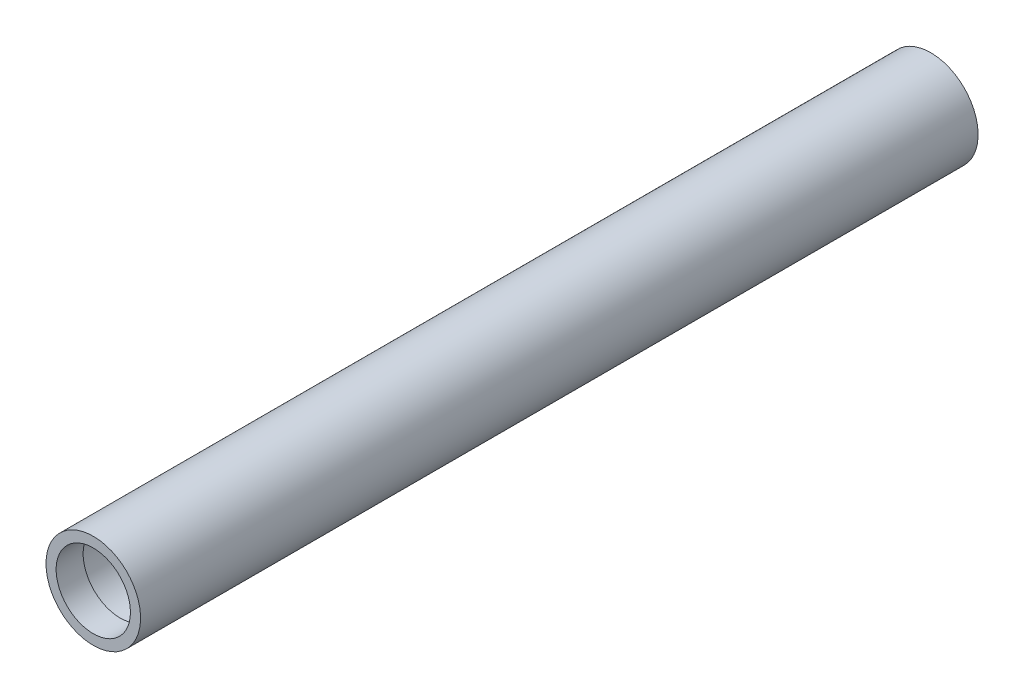
ISO-10303-21;
HEADER;
FILE_DESCRIPTION(('STEP AP214'),'2;1');
FILE_NAME('part.step','',(''),(''),'','','');
FILE_SCHEMA(('AUTOMOTIVE_DESIGN { 1 0 10303 214 1 1 1 1 }'));
ENDSEC;
DATA;
#1=APPLICATION_CONTEXT('core data for automotive mechanical design processes');
#2=APPLICATION_PROTOCOL_DEFINITION('international standard','automotive_design',2000,#1);
#3=PRODUCT_CONTEXT('',#1,'mechanical');
#4=PRODUCT('Part','Part','',(#3));
#5=PRODUCT_RELATED_PRODUCT_CATEGORY('part','',(#4));
#6=PRODUCT_DEFINITION_FORMATION('','',#4);
#7=PRODUCT_DEFINITION_CONTEXT('part definition',#1,'design');
#8=PRODUCT_DEFINITION('design','',#6,#7);
#9=PRODUCT_DEFINITION_SHAPE('','',#8);
#10=(LENGTH_UNIT() NAMED_UNIT(*) SI_UNIT(.MILLI.,.METRE.));
#11=(NAMED_UNIT(*) PLANE_ANGLE_UNIT() SI_UNIT($,.RADIAN.));
#12=(NAMED_UNIT(*) SI_UNIT($,.STERADIAN.) SOLID_ANGLE_UNIT());
#13=UNCERTAINTY_MEASURE_WITH_UNIT(LENGTH_MEASURE(1.E-05),#10,'distance_accuracy_value','');
#14=(GEOMETRIC_REPRESENTATION_CONTEXT(3) GLOBAL_UNCERTAINTY_ASSIGNED_CONTEXT((#13)) GLOBAL_UNIT_ASSIGNED_CONTEXT((#10,
#11,#12)) REPRESENTATION_CONTEXT('',''));
#15=CARTESIAN_POINT('',(0.,0.,0.));
#16=DIRECTION('',(0.,0.,1.));
#17=DIRECTION('',(1.,0.,0.));
#18=AXIS2_PLACEMENT_3D('',#15,#16,#17);
#19=CARTESIAN_POINT('',(0.,0.,0.));
#20=DIRECTION('',(0.,0.,1.));
#21=DIRECTION('',(1.,0.,0.));
#22=AXIS2_PLACEMENT_3D('',#19,#20,#21);
#23=PLANE('',#22);
#24=CARTESIAN_POINT('',(0.,0.,0.));
#25=DIRECTION('',(0.,0.,1.));
#26=DIRECTION('',(1.,0.,0.));
#27=AXIS2_PLACEMENT_3D('',#24,#25,#26);
#28=CIRCLE('',#27,4.445);
#29=CARTESIAN_POINT('',(-4.445,0.,0.));
#30=VERTEX_POINT('',#29);
#31=EDGE_CURVE('E10',#30,#30,#28,.T.);
#32=ORIENTED_EDGE('',*,*,#31,.F.);
#33=EDGE_LOOP('',(#32));
#34=FACE_BOUND('',#33,.T.);
#35=CARTESIAN_POINT('',(0.,0.,0.));
#36=DIRECTION('',(0.,0.,1.));
#37=DIRECTION('',(1.,0.,0.));
#38=AXIS2_PLACEMENT_3D('',#35,#36,#37);
#39=CIRCLE('',#38,3.81);
#40=CARTESIAN_POINT('',(-3.81,0.,0.));
#41=VERTEX_POINT('',#40);
#42=EDGE_CURVE('E38',#41,#41,#39,.T.);
#43=ORIENTED_EDGE('',*,*,#42,.T.);
#44=EDGE_LOOP('',(#43));
#45=FACE_BOUND('',#44,.T.);
#46=ADVANCED_FACE('F31',(#34,#45),#23,.F.);
#47=CARTESIAN_POINT('',(0.,0.,76.2));
#48=DIRECTION('',(0.,0.,-1.));
#49=DIRECTION('',(-1.,0.,0.));
#50=AXIS2_PLACEMENT_3D('',#47,#48,#49);
#51=CYLINDRICAL_SURFACE('',#50,4.445);
#52=CARTESIAN_POINT('',(0.,0.,78.74));
#53=DIRECTION('',(0.,0.,1.));
#54=DIRECTION('',(1.,0.,0.));
#55=AXIS2_PLACEMENT_3D('',#52,#53,#54);
#56=CIRCLE('',#55,4.445);
#57=CARTESIAN_POINT('',(-4.445,0.,78.74));
#58=VERTEX_POINT('',#57);
#59=EDGE_CURVE('E46',#58,#58,#56,.T.);
#60=CARTESIAN_POINT('',(-4.445,0.,0.));
#61=CARTESIAN_POINT('',(-4.445,0.,0.82020833333333));
#62=CARTESIAN_POINT('',(-4.445,0.,1.64041666666666));
#63=CARTESIAN_POINT('',(-4.445,0.,3.28083333333333));
#64=CARTESIAN_POINT('',(-4.445,0.,4.10104166666667));
#65=CARTESIAN_POINT('',(-4.445,0.,5.74145833333333));
#66=CARTESIAN_POINT('',(-4.445,0.,6.56166666666666));
#67=CARTESIAN_POINT('',(-4.445,0.,8.20208333333333));
#68=CARTESIAN_POINT('',(-4.445,0.,9.02229166666667));
#69=CARTESIAN_POINT('',(-4.445,0.,10.6627083333333));
#70=CARTESIAN_POINT('',(-4.445,0.,11.4829166666667));
#71=CARTESIAN_POINT('',(-4.445,0.,13.1233333333333));
#72=CARTESIAN_POINT('',(-4.445,0.,13.9435416666667));
#73=CARTESIAN_POINT('',(-4.445,0.,15.5839583333333));
#74=CARTESIAN_POINT('',(-4.445,0.,16.4041666666667));
#75=CARTESIAN_POINT('',(-4.445,0.,18.0445833333333));
#76=CARTESIAN_POINT('',(-4.445,0.,18.8647916666667));
#77=CARTESIAN_POINT('',(-4.445,0.,20.5052083333333));
#78=CARTESIAN_POINT('',(-4.445,0.,21.3254166666667));
#79=CARTESIAN_POINT('',(-4.445,0.,22.9658333333333));
#80=CARTESIAN_POINT('',(-4.445,0.,23.7860416666667));
#81=CARTESIAN_POINT('',(-4.445,0.,25.4264583333333));
#82=CARTESIAN_POINT('',(-4.445,0.,26.2466666666667));
#83=CARTESIAN_POINT('',(-4.445,0.,27.8870833333333));
#84=CARTESIAN_POINT('',(-4.445,0.,28.7072916666667));
#85=CARTESIAN_POINT('',(-4.445,0.,30.3477083333333));
#86=CARTESIAN_POINT('',(-4.445,0.,31.1679166666667));
#87=CARTESIAN_POINT('',(-4.445,0.,32.8083333333333));
#88=CARTESIAN_POINT('',(-4.445,0.,33.6285416666667));
#89=CARTESIAN_POINT('',(-4.445,0.,35.2689583333333));
#90=CARTESIAN_POINT('',(-4.445,0.,36.0891666666667));
#91=CARTESIAN_POINT('',(-4.445,0.,37.7295833333333));
#92=CARTESIAN_POINT('',(-4.445,0.,38.5497916666667));
#93=CARTESIAN_POINT('',(-4.445,0.,40.1902083333333));
#94=CARTESIAN_POINT('',(-4.445,0.,41.0104166666667));
#95=CARTESIAN_POINT('',(-4.445,0.,42.6508333333333));
#96=CARTESIAN_POINT('',(-4.445,0.,43.4710416666667));
#97=CARTESIAN_POINT('',(-4.445,0.,45.1114583333333));
#98=CARTESIAN_POINT('',(-4.445,0.,45.9316666666667));
#99=CARTESIAN_POINT('',(-4.445,0.,47.5720833333333));
#100=CARTESIAN_POINT('',(-4.445,0.,48.3922916666667));
#101=CARTESIAN_POINT('',(-4.445,0.,50.0327083333333));
#102=CARTESIAN_POINT('',(-4.445,0.,50.8529166666667));
#103=CARTESIAN_POINT('',(-4.445,0.,52.4933333333333));
#104=CARTESIAN_POINT('',(-4.445,0.,53.3135416666667));
#105=CARTESIAN_POINT('',(-4.445,0.,54.9539583333333));
#106=CARTESIAN_POINT('',(-4.445,0.,55.7741666666667));
#107=CARTESIAN_POINT('',(-4.445,0.,57.4145833333333));
#108=CARTESIAN_POINT('',(-4.445,0.,58.2347916666667));
#109=CARTESIAN_POINT('',(-4.445,0.,59.8752083333333));
#110=CARTESIAN_POINT('',(-4.445,0.,60.6954166666667));
#111=CARTESIAN_POINT('',(-4.445,0.,62.3358333333333));
#112=CARTESIAN_POINT('',(-4.445,0.,63.1560416666666));
#113=CARTESIAN_POINT('',(-4.445,0.,64.7964583333333));
#114=CARTESIAN_POINT('',(-4.445,0.,65.6166666666667));
#115=CARTESIAN_POINT('',(-4.445,0.,67.2570833333333));
#116=CARTESIAN_POINT('',(-4.445,0.,68.0772916666667));
#117=CARTESIAN_POINT('',(-4.445,0.,69.7177083333333));
#118=CARTESIAN_POINT('',(-4.445,0.,70.5379166666667));
#119=CARTESIAN_POINT('',(-4.445,0.,72.1783333333333));
#120=CARTESIAN_POINT('',(-4.445,0.,72.9985416666667));
#121=CARTESIAN_POINT('',(-4.445,0.,74.6389583333333));
#122=CARTESIAN_POINT('',(-4.445,0.,75.4591666666667));
#123=CARTESIAN_POINT('',(-4.445,0.,77.0995833333333));
#124=CARTESIAN_POINT('',(-4.445,0.,77.9197916666667));
#125=CARTESIAN_POINT('',(-4.445,0.,78.74));
#126=B_SPLINE_CURVE_WITH_KNOTS('',3,(#60,#61,#62,#63,#64,#65,#66,#67,#68,#69,#70,#71,#72,#73,
#74,#75,#76,#77,#78,#79,#80,#81,#82,#83,#84,#85,#86,#87,#88,#89,#90,#91,#92,#93,#94,#95,#96,#97,
#98,#99,#100,#101,#102,#103,#104,#105,#106,#107,#108,#109,#110,#111,#112,#113,#114,#115,#116,
#117,#118,#119,#120,#121,#122,#123,#124,#125),.UNSPECIFIED.,.F.,.F.,(4,2,2,2,2,2,2,2,2,2,2,2,2,
2,2,2,2,2,2,2,2,2,2,2,2,2,2,2,2,2,2,2,4),(0.,2.46062499999999,4.92125,7.381875,9.8425,12.303125,
14.76375,17.224375,19.685,22.145625,24.60625,27.066875,29.5275,31.988125,34.44875,36.909375,
39.37,41.830625,44.29125,46.751875,49.2125,51.673125,54.13375,56.594375,59.055,61.515625,
63.97625,66.436875,68.8975,71.358125,73.81875,76.279375,78.74),.UNSPECIFIED.);
#127=EDGE_CURVE('BSEAM33',#30,#58,#126,.T.);
#128=ORIENTED_EDGE('',*,*,#31,.T.);
#129=ORIENTED_EDGE('',*,*,#59,.F.);
#130=ORIENTED_EDGE('',*,*,#127,.T.);
#131=ORIENTED_EDGE('',*,*,#127,.F.);
#132=EDGE_LOOP('',(#128,#130,#129,#131));
#133=FACE_BOUND('',#132,.T.);
#134=ADVANCED_FACE('F33',(#133),#51,.T.);
#135=CARTESIAN_POINT('',(0.,0.,76.2));
#136=DIRECTION('',(0.,0.,-1.));
#137=DIRECTION('',(-1.,0.,0.));
#138=AXIS2_PLACEMENT_3D('',#135,#136,#137);
#139=CYLINDRICAL_SURFACE('',#138,3.81);
#140=CARTESIAN_POINT('',(0.,0.,76.2));
#141=DIRECTION('',(0.,0.,1.));
#142=DIRECTION('',(1.,0.,0.));
#143=AXIS2_PLACEMENT_3D('',#140,#141,#142);
#144=CIRCLE('',#143,3.81);
#145=CARTESIAN_POINT('',(-3.81,0.,76.2));
#146=VERTEX_POINT('',#145);
#147=EDGE_CURVE('E42',#146,#146,#144,.T.);
#148=CARTESIAN_POINT('',(-3.81,0.,76.2));
#149=CARTESIAN_POINT('',(-3.81,0.,75.40625));
#150=CARTESIAN_POINT('',(-3.81,0.,74.6125));
#151=CARTESIAN_POINT('',(-3.81,0.,73.025));
#152=CARTESIAN_POINT('',(-3.81,0.,72.23125));
#153=CARTESIAN_POINT('',(-3.81,0.,70.64375));
#154=CARTESIAN_POINT('',(-3.81,0.,69.85));
#155=CARTESIAN_POINT('',(-3.81,0.,68.2625));
#156=CARTESIAN_POINT('',(-3.81,0.,67.46875));
#157=CARTESIAN_POINT('',(-3.81,0.,65.88125));
#158=CARTESIAN_POINT('',(-3.81,0.,65.0875));
#159=CARTESIAN_POINT('',(-3.81,0.,63.5));
#160=CARTESIAN_POINT('',(-3.81,0.,62.70625));
#161=CARTESIAN_POINT('',(-3.81,0.,61.11875));
#162=CARTESIAN_POINT('',(-3.81,0.,60.325));
#163=CARTESIAN_POINT('',(-3.81,0.,58.7375));
#164=CARTESIAN_POINT('',(-3.81,0.,57.94375));
#165=CARTESIAN_POINT('',(-3.81,0.,56.35625));
#166=CARTESIAN_POINT('',(-3.81,0.,55.5625));
#167=CARTESIAN_POINT('',(-3.81,0.,53.975));
#168=CARTESIAN_POINT('',(-3.81,0.,53.18125));
#169=CARTESIAN_POINT('',(-3.81,0.,51.59375));
#170=CARTESIAN_POINT('',(-3.81,0.,50.8));
#171=CARTESIAN_POINT('',(-3.81,0.,49.2125));
#172=CARTESIAN_POINT('',(-3.81,0.,48.41875));
#173=CARTESIAN_POINT('',(-3.81,0.,46.83125));
#174=CARTESIAN_POINT('',(-3.81,0.,46.0375));
#175=CARTESIAN_POINT('',(-3.81,0.,44.45));
#176=CARTESIAN_POINT('',(-3.81,0.,43.65625));
#177=CARTESIAN_POINT('',(-3.81,0.,42.06875));
#178=CARTESIAN_POINT('',(-3.81,0.,41.275));
#179=CARTESIAN_POINT('',(-3.81,0.,39.6875));
#180=CARTESIAN_POINT('',(-3.81,0.,38.89375));
#181=CARTESIAN_POINT('',(-3.81,0.,37.30625));
#182=CARTESIAN_POINT('',(-3.81,0.,36.5125));
#183=CARTESIAN_POINT('',(-3.81,0.,34.925));
#184=CARTESIAN_POINT('',(-3.81,0.,34.13125));
#185=CARTESIAN_POINT('',(-3.81,0.,32.54375));
#186=CARTESIAN_POINT('',(-3.81,0.,31.75));
#187=CARTESIAN_POINT('',(-3.81,0.,30.1625));
#188=CARTESIAN_POINT('',(-3.81,0.,29.36875));
#189=CARTESIAN_POINT('',(-3.81,0.,27.78125));
#190=CARTESIAN_POINT('',(-3.81,0.,26.9875));
#191=CARTESIAN_POINT('',(-3.81,0.,25.4));
#192=CARTESIAN_POINT('',(-3.81,0.,24.60625));
#193=CARTESIAN_POINT('',(-3.81,0.,23.01875));
#194=CARTESIAN_POINT('',(-3.81,0.,22.225));
#195=CARTESIAN_POINT('',(-3.81,0.,20.6375));
#196=CARTESIAN_POINT('',(-3.81,0.,19.84375));
#197=CARTESIAN_POINT('',(-3.81,0.,18.25625));
#198=CARTESIAN_POINT('',(-3.81,0.,17.4625));
#199=CARTESIAN_POINT('',(-3.81,0.,15.875));
#200=CARTESIAN_POINT('',(-3.81,0.,15.08125));
#201=CARTESIAN_POINT('',(-3.81,0.,13.49375));
#202=CARTESIAN_POINT('',(-3.81,0.,12.7));
#203=CARTESIAN_POINT('',(-3.81,0.,11.1125));
#204=CARTESIAN_POINT('',(-3.81,0.,10.31875));
#205=CARTESIAN_POINT('',(-3.81,0.,8.73125));
#206=CARTESIAN_POINT('',(-3.81,0.,7.93750000000001));
#207=CARTESIAN_POINT('',(-3.81,0.,6.35));
#208=CARTESIAN_POINT('',(-3.81,0.,5.55625));
#209=CARTESIAN_POINT('',(-3.81,0.,3.96875));
#210=CARTESIAN_POINT('',(-3.81,0.,3.175));
#211=CARTESIAN_POINT('',(-3.81,0.,1.5875));
#212=CARTESIAN_POINT('',(-3.81,0.,0.793750000000001));
#213=CARTESIAN_POINT('',(-3.81,0.,0.));
#214=B_SPLINE_CURVE_WITH_KNOTS('',3,(#148,#149,#150,#151,#152,#153,#154,#155,#156,#157,#158,
#159,#160,#161,#162,#163,#164,#165,#166,#167,#168,#169,#170,#171,#172,#173,#174,#175,#176,#177,
#178,#179,#180,#181,#182,#183,#184,#185,#186,#187,#188,#189,#190,#191,#192,#193,#194,#195,#196,
#197,#198,#199,#200,#201,#202,#203,#204,#205,#206,#207,#208,#209,#210,#211,#212,#213),
.UNSPECIFIED.,.F.,.F.,(4,2,2,2,2,2,2,2,2,2,2,2,2,2,2,2,2,2,2,2,2,2,2,2,2,2,2,2,2,2,2,2,4),(0.,
2.38125,4.7625,7.14375,9.52500000000001,11.90625,14.2875,16.66875,19.05,21.43125,23.8125,
26.19375,28.575,30.95625,33.3375,35.71875,38.1,40.48125,42.8625,45.24375,47.625,50.00625,
52.3875,54.76875,57.15,59.53125,61.9125,64.29375,66.675,69.05625,71.4375,73.81875,76.2),.UNSPECIFIED.);
#215=EDGE_CURVE('BSEAM71',#146,#41,#214,.T.);
#216=ORIENTED_EDGE('',*,*,#147,.T.);
#217=ORIENTED_EDGE('',*,*,#42,.F.);
#218=ORIENTED_EDGE('',*,*,#215,.T.);
#219=ORIENTED_EDGE('',*,*,#215,.F.);
#220=EDGE_LOOP('',(#216,#218,#217,#219));
#221=FACE_BOUND('',#220,.T.);
#222=ADVANCED_FACE('F71',(#221),#139,.F.);
#223=CARTESIAN_POINT('',(0.,0.,76.2));
#224=DIRECTION('',(0.,0.,1.));
#225=DIRECTION('',(1.,0.,0.));
#226=AXIS2_PLACEMENT_3D('',#223,#224,#225);
#227=PLANE('',#226);
#228=CARTESIAN_POINT('',(0.,0.,76.2));
#229=DIRECTION('',(0.,0.,1.));
#230=DIRECTION('',(1.,0.,0.));
#231=AXIS2_PLACEMENT_3D('',#228,#229,#230);
#232=CIRCLE('',#231,3.4925);
#233=CARTESIAN_POINT('',(3.4925,0.,76.2));
#234=VERTEX_POINT('',#233);
#235=EDGE_CURVE('E52',#234,#234,#232,.T.);
#236=ORIENTED_EDGE('',*,*,#235,.T.);
#237=EDGE_LOOP('',(#236));
#238=FACE_BOUND('',#237,.T.);
#239=ORIENTED_EDGE('',*,*,#147,.F.);
#240=EDGE_LOOP('',(#239));
#241=FACE_BOUND('',#240,.T.);
#242=ADVANCED_FACE('F63',(#238,#241),#227,.F.);
#243=CARTESIAN_POINT('',(0.,0.,78.74));
#244=DIRECTION('',(0.,0.,1.));
#245=DIRECTION('',(1.,0.,0.));
#246=AXIS2_PLACEMENT_3D('',#243,#244,#245);
#247=PLANE('',#246);
#248=ORIENTED_EDGE('',*,*,#59,.T.);
#249=EDGE_LOOP('',(#248));
#250=FACE_BOUND('',#249,.T.);
#251=CARTESIAN_POINT('',(0.,0.,78.74));
#252=DIRECTION('',(0.,0.,1.));
#253=DIRECTION('',(1.,0.,0.));
#254=AXIS2_PLACEMENT_3D('',#251,#252,#253);
#255=CIRCLE('',#254,3.4925);
#256=CARTESIAN_POINT('',(3.4925,0.,78.74));
#257=VERTEX_POINT('',#256);
#258=EDGE_CURVE('E51',#257,#257,#255,.T.);
#259=ORIENTED_EDGE('',*,*,#258,.F.);
#260=EDGE_LOOP('',(#259));
#261=FACE_BOUND('',#260,.T.);
#262=ADVANCED_FACE('F61',(#250,#261),#247,.T.);
#263=CARTESIAN_POINT('',(0.,0.,78.74));
#264=DIRECTION('',(0.,0.,-1.));
#265=DIRECTION('',(-1.,0.,0.));
#266=AXIS2_PLACEMENT_3D('',#263,#264,#265);
#267=CYLINDRICAL_SURFACE('',#266,3.4925);
#268=ORIENTED_EDGE('',*,*,#258,.T.);
#269=EDGE_LOOP('',(#268));
#270=FACE_BOUND('',#269,.T.);
#271=ORIENTED_EDGE('',*,*,#235,.F.);
#272=EDGE_LOOP('',(#271));
#273=FACE_BOUND('',#272,.T.);
#274=ADVANCED_FACE('F58',(#270,#273),#267,.F.);
#275=CLOSED_SHELL('',(#46,#134,#222,#242,#262,#274));
#276=MANIFOLD_SOLID_BREP('B2',#275);
#277=ADVANCED_BREP_SHAPE_REPRESENTATION('',(#18,#276),#14);
#278=SHAPE_DEFINITION_REPRESENTATION(#9,#277);
ENDSEC;
END-ISO-10303-21;
